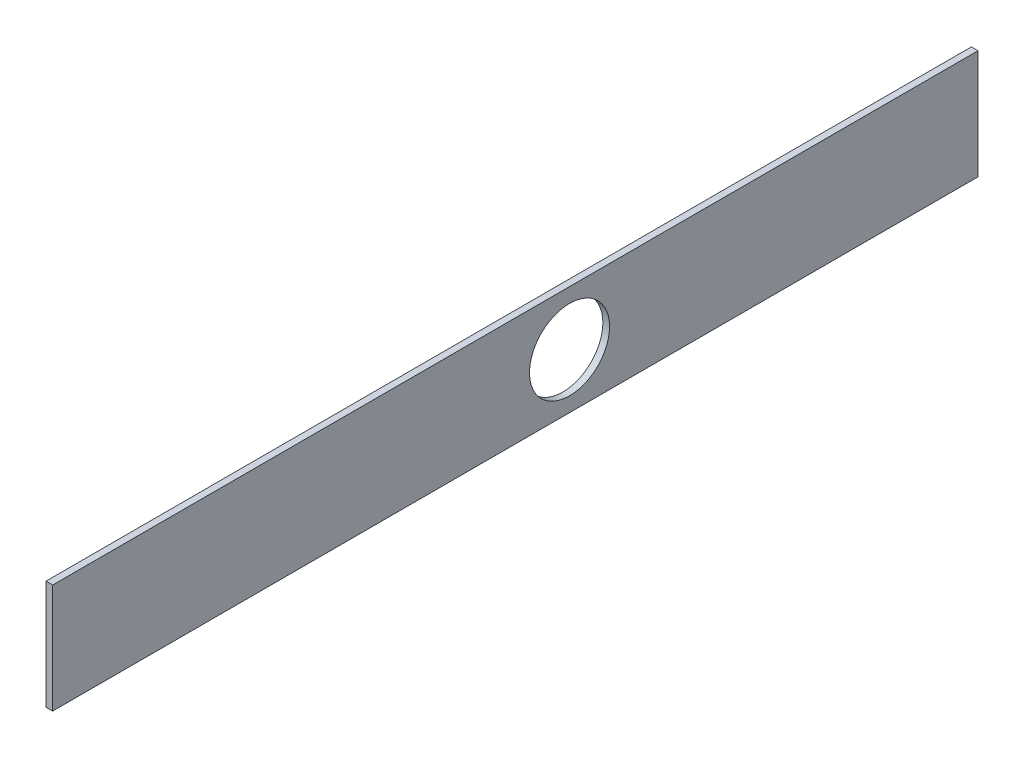
ISO-10303-21;
HEADER;
FILE_DESCRIPTION(('STEP AP214'),'2;1');
FILE_NAME('part.step','',(''),(''),'','','');
FILE_SCHEMA(('AUTOMOTIVE_DESIGN { 1 0 10303 214 1 1 1 1 }'));
ENDSEC;
DATA;
#1=APPLICATION_CONTEXT('core data for automotive mechanical design processes');
#2=APPLICATION_PROTOCOL_DEFINITION('international standard','automotive_design',2000,#1);
#3=PRODUCT_CONTEXT('',#1,'mechanical');
#4=PRODUCT('Part','Part','',(#3));
#5=PRODUCT_RELATED_PRODUCT_CATEGORY('part','',(#4));
#6=PRODUCT_DEFINITION_FORMATION('','',#4);
#7=PRODUCT_DEFINITION_CONTEXT('part definition',#1,'design');
#8=PRODUCT_DEFINITION('design','',#6,#7);
#9=PRODUCT_DEFINITION_SHAPE('','',#8);
#10=(LENGTH_UNIT() NAMED_UNIT(*) SI_UNIT(.MILLI.,.METRE.));
#11=(NAMED_UNIT(*) PLANE_ANGLE_UNIT() SI_UNIT($,.RADIAN.));
#12=(NAMED_UNIT(*) SI_UNIT($,.STERADIAN.) SOLID_ANGLE_UNIT());
#13=UNCERTAINTY_MEASURE_WITH_UNIT(LENGTH_MEASURE(1.E-05),#10,'distance_accuracy_value','');
#14=(GEOMETRIC_REPRESENTATION_CONTEXT(3) GLOBAL_UNCERTAINTY_ASSIGNED_CONTEXT((#13)) GLOBAL_UNIT_ASSIGNED_CONTEXT((#10,
#11,#12)) REPRESENTATION_CONTEXT('',''));
#15=CARTESIAN_POINT('',(0.,0.,0.));
#16=DIRECTION('',(0.,0.,1.));
#17=DIRECTION('',(1.,0.,0.));
#18=AXIS2_PLACEMENT_3D('',#15,#16,#17);
#19=CARTESIAN_POINT('',(8.00000000000001,0.,-1.55431223447522E-12));
#20=DIRECTION('',(1.,0.,0.));
#21=DIRECTION('',(0.,0.,-0.999999999999989));
#22=AXIS2_PLACEMENT_3D('',#19,#20,#21);
#23=PLANE('',#22);
#24=DIRECTION('',(0.,-0.999999999999989,0.));
#25=VECTOR('',#24,1.);
#26=CARTESIAN_POINT('',(8.00000000000012,65.4999999999983,619.999999999984));
#27=LINE('',#26,#25);
#28=CARTESIAN_POINT('',(8.00000000000012,65.4999999999983,619.999999999984));
#29=VERTEX_POINT('',#28);
#30=CARTESIAN_POINT('',(8.00000000000001,-65.4999999999996,619.999999999984));
#31=VERTEX_POINT('',#30);
#32=EDGE_CURVE('E84',#29,#31,#27,.T.);
#33=ORIENTED_EDGE('',*,*,#32,.T.);
#34=DIRECTION('',(0.,0.,-0.999999999999989));
#35=VECTOR('',#34,1.);
#36=CARTESIAN_POINT('',(8.00000000000001,-65.4999999999996,619.999999999984));
#37=LINE('',#36,#35);
#38=CARTESIAN_POINT('',(7.99999999999992,-65.4999999999996,-489.999999999994));
#39=VERTEX_POINT('',#38);
#40=EDGE_CURVE('E79',#31,#39,#37,.T.);
#41=ORIENTED_EDGE('',*,*,#40,.T.);
#42=DIRECTION('',(0.,0.999999999999989,0.));
#43=VECTOR('',#42,1.);
#44=CARTESIAN_POINT('',(8.00000000000006,65.4999999999983,-489.999999999994));
#45=LINE('',#44,#43);
#46=CARTESIAN_POINT('',(8.00000000000006,65.4999999999983,-489.999999999994));
#47=VERTEX_POINT('',#46);
#48=EDGE_CURVE('E82',#39,#47,#45,.T.);
#49=ORIENTED_EDGE('',*,*,#48,.T.);
#50=DIRECTION('',(0.,0.,0.999999999999989));
#51=VECTOR('',#50,1.);
#52=CARTESIAN_POINT('',(8.00000000000012,65.4999999999983,619.999999999984));
#53=LINE('',#52,#51);
#54=EDGE_CURVE('E49',#47,#29,#53,.T.);
#55=ORIENTED_EDGE('',*,*,#54,.T.);
#56=EDGE_LOOP('',(#33,#41,#49,#55));
#57=FACE_BOUND('',#56,.T.);
#58=CARTESIAN_POINT('',(8.00000000000001,0.,-1.55431223447522E-12));
#59=DIRECTION('',(1.,0.,0.));
#60=DIRECTION('',(0.,0.,-0.999999999999989));
#61=AXIS2_PLACEMENT_3D('',#58,#59,#60);
#62=CIRCLE('',#61,48.);
#63=CARTESIAN_POINT('',(8.00000000000001,0.,-48.000000000001));
#64=VERTEX_POINT('',#63);
#65=EDGE_CURVE('E99',#64,#64,#62,.T.);
#66=ORIENTED_EDGE('',*,*,#65,.F.);
#67=EDGE_LOOP('',(#66));
#68=FACE_BOUND('',#67,.T.);
#69=ADVANCED_FACE('F32',(#57,#68),#23,.T.);
#70=CARTESIAN_POINT('',(0.,0.,0.));
#71=DIRECTION('',(1.,0.,0.));
#72=DIRECTION('',(0.,0.,-0.999999999999989));
#73=AXIS2_PLACEMENT_3D('',#70,#71,#72);
#74=PLANE('',#73);
#75=DIRECTION('',(0.,-0.999999999999989,0.));
#76=VECTOR('',#75,1.);
#77=CARTESIAN_POINT('',(0.,65.4999999999997,619.999999999984));
#78=LINE('',#77,#76);
#79=CARTESIAN_POINT('',(0.,65.4999999999997,619.999999999984));
#80=VERTEX_POINT('',#79);
#81=CARTESIAN_POINT('',(0.,-65.4999999999992,619.999999999984));
#82=VERTEX_POINT('',#81);
#83=EDGE_CURVE('E96',#80,#82,#78,.T.);
#84=ORIENTED_EDGE('',*,*,#83,.F.);
#85=DIRECTION('',(0.,0.,0.999999999999989));
#86=VECTOR('',#85,1.);
#87=CARTESIAN_POINT('',(0.,65.4999999999997,619.999999999984));
#88=LINE('',#87,#86);
#89=CARTESIAN_POINT('',(0.,65.4999999999994,-489.999999999994));
#90=VERTEX_POINT('',#89);
#91=EDGE_CURVE('E72',#90,#80,#88,.T.);
#92=ORIENTED_EDGE('',*,*,#91,.F.);
#93=DIRECTION('',(0.,0.999999999999989,0.));
#94=VECTOR('',#93,1.);
#95=CARTESIAN_POINT('',(0.,65.4999999999994,-489.999999999994));
#96=LINE('',#95,#94);
#97=CARTESIAN_POINT('',(0.,-65.4999999999992,-489.999999999994));
#98=VERTEX_POINT('',#97);
#99=EDGE_CURVE('E66',#98,#90,#96,.T.);
#100=ORIENTED_EDGE('',*,*,#99,.F.);
#101=DIRECTION('',(0.,0.,-0.999999999999989));
#102=VECTOR('',#101,1.);
#103=CARTESIAN_POINT('',(0.,-65.4999999999992,619.999999999984));
#104=LINE('',#103,#102);
#105=EDGE_CURVE('E88',#82,#98,#104,.T.);
#106=ORIENTED_EDGE('',*,*,#105,.F.);
#107=EDGE_LOOP('',(#84,#92,#100,#106));
#108=FACE_BOUND('',#107,.T.);
#109=CARTESIAN_POINT('',(0.,0.,0.));
#110=DIRECTION('',(1.,0.,0.));
#111=DIRECTION('',(0.,0.,-0.999999999999989));
#112=AXIS2_PLACEMENT_3D('',#109,#110,#111);
#113=CIRCLE('',#112,48.);
#114=CARTESIAN_POINT('',(0.,0.,-47.9999999999995));
#115=VERTEX_POINT('',#114);
#116=EDGE_CURVE('E111',#115,#115,#113,.T.);
#117=ORIENTED_EDGE('',*,*,#116,.T.);
#118=EDGE_LOOP('',(#117));
#119=FACE_BOUND('',#118,.T.);
#120=ADVANCED_FACE('F107',(#108,#119),#74,.F.);
#121=CARTESIAN_POINT('',(8.00000000000012,65.4999999999983,619.999999999984));
#122=DIRECTION('',(0.,0.,-0.999999999999989));
#123=DIRECTION('',(-1.,0.,0.));
#124=AXIS2_PLACEMENT_3D('',#121,#122,#123);
#125=PLANE('',#124);
#126=ORIENTED_EDGE('',*,*,#83,.T.);
#127=DIRECTION('',(-1.,0.,0.));
#128=VECTOR('',#127,1.);
#129=CARTESIAN_POINT('',(8.00000000000001,-65.4999999999996,619.999999999984));
#130=LINE('',#129,#128);
#131=EDGE_CURVE('E11',#31,#82,#130,.T.);
#132=ORIENTED_EDGE('',*,*,#131,.F.);
#133=ORIENTED_EDGE('',*,*,#32,.F.);
#134=DIRECTION('',(-1.,0.,0.));
#135=VECTOR('',#134,1.);
#136=CARTESIAN_POINT('',(8.00000000000012,65.4999999999983,619.999999999984));
#137=LINE('',#136,#135);
#138=EDGE_CURVE('E92',#29,#80,#137,.T.);
#139=ORIENTED_EDGE('',*,*,#138,.T.);
#140=EDGE_LOOP('',(#126,#132,#133,#139));
#141=FACE_BOUND('',#140,.T.);
#142=ADVANCED_FACE('F34',(#141),#125,.F.);
#143=CARTESIAN_POINT('',(8.00000000000001,-65.4999999999996,619.999999999984));
#144=DIRECTION('',(0.,0.999999999999989,0.));
#145=DIRECTION('',(0.,0.,0.999999999999989));
#146=AXIS2_PLACEMENT_3D('',#143,#144,#145);
#147=PLANE('',#146);
#148=ORIENTED_EDGE('',*,*,#105,.T.);
#149=DIRECTION('',(-1.,0.,0.));
#150=VECTOR('',#149,1.);
#151=CARTESIAN_POINT('',(7.99999999999992,-65.4999999999996,-489.999999999994));
#152=LINE('',#151,#150);
#153=EDGE_CURVE('E41',#39,#98,#152,.T.);
#154=ORIENTED_EDGE('',*,*,#153,.F.);
#155=ORIENTED_EDGE('',*,*,#40,.F.);
#156=ORIENTED_EDGE('',*,*,#131,.T.);
#157=EDGE_LOOP('',(#148,#154,#155,#156));
#158=FACE_BOUND('',#157,.T.);
#159=ADVANCED_FACE('F87',(#158),#147,.F.);
#160=CARTESIAN_POINT('',(8.00000000000006,65.4999999999983,-489.999999999994));
#161=DIRECTION('',(0.,0.,0.999999999999989));
#162=DIRECTION('',(1.,0.,0.));
#163=AXIS2_PLACEMENT_3D('',#160,#161,#162);
#164=PLANE('',#163);
#165=ORIENTED_EDGE('',*,*,#99,.T.);
#166=DIRECTION('',(-1.,0.,0.));
#167=VECTOR('',#166,1.);
#168=CARTESIAN_POINT('',(8.00000000000006,65.4999999999983,-489.999999999994));
#169=LINE('',#168,#167);
#170=EDGE_CURVE('E89',#47,#90,#169,.T.);
#171=ORIENTED_EDGE('',*,*,#170,.F.);
#172=ORIENTED_EDGE('',*,*,#48,.F.);
#173=ORIENTED_EDGE('',*,*,#153,.T.);
#174=EDGE_LOOP('',(#165,#171,#172,#173));
#175=FACE_BOUND('',#174,.T.);
#176=ADVANCED_FACE('F90',(#175),#164,.F.);
#177=CARTESIAN_POINT('',(8.00000000000012,65.4999999999983,619.999999999984));
#178=DIRECTION('',(0.,-0.999999999999989,0.));
#179=DIRECTION('',(0.,0.,-0.999999999999989));
#180=AXIS2_PLACEMENT_3D('',#177,#178,#179);
#181=PLANE('',#180);
#182=ORIENTED_EDGE('',*,*,#91,.T.);
#183=ORIENTED_EDGE('',*,*,#138,.F.);
#184=ORIENTED_EDGE('',*,*,#54,.F.);
#185=ORIENTED_EDGE('',*,*,#170,.T.);
#186=EDGE_LOOP('',(#182,#183,#184,#185));
#187=FACE_BOUND('',#186,.T.);
#188=ADVANCED_FACE('F104',(#187),#181,.F.);
#189=CARTESIAN_POINT('',(8.00000000000001,0.,-1.55431223447522E-12));
#190=DIRECTION('',(-1.,0.,0.));
#191=DIRECTION('',(0.,0.,0.999999999999989));
#192=AXIS2_PLACEMENT_3D('',#189,#190,#191);
#193=CYLINDRICAL_SURFACE('',#192,48.);
#194=ORIENTED_EDGE('',*,*,#65,.T.);
#195=EDGE_LOOP('',(#194));
#196=FACE_BOUND('',#195,.T.);
#197=ORIENTED_EDGE('',*,*,#116,.F.);
#198=EDGE_LOOP('',(#197));
#199=FACE_BOUND('',#198,.T.);
#200=ADVANCED_FACE('F117',(#196,#199),#193,.F.);
#201=CLOSED_SHELL('',(#69,#120,#142,#159,#176,#188,#200));
#202=MANIFOLD_SOLID_BREP('B2',#201);
#203=ADVANCED_BREP_SHAPE_REPRESENTATION('',(#18,#202),#14);
#204=SHAPE_DEFINITION_REPRESENTATION(#9,#203);
ENDSEC;
END-ISO-10303-21;
